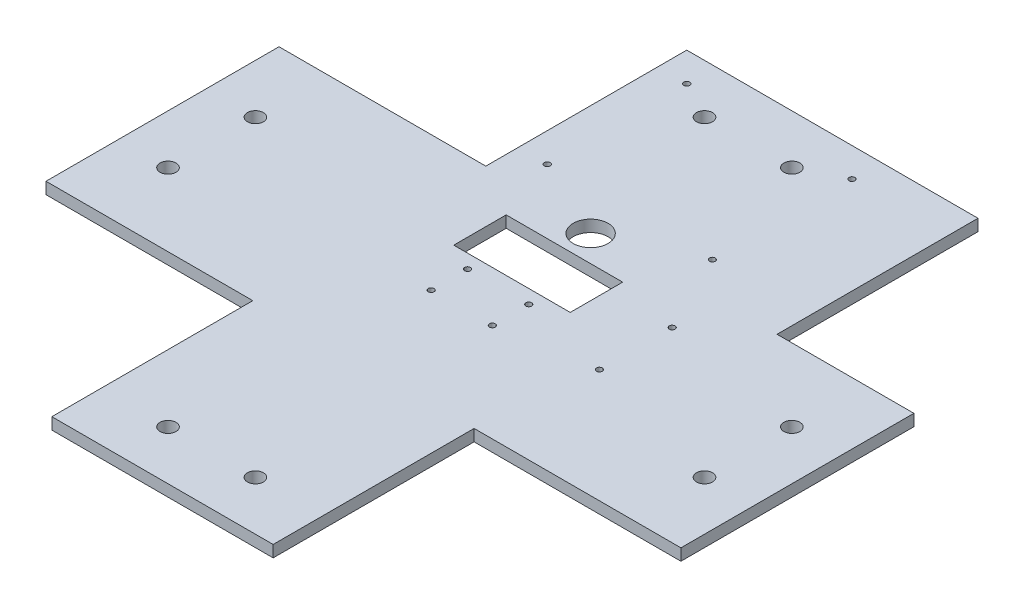
ISO-10303-21;
HEADER;
FILE_DESCRIPTION(('STEP AP214'),'2;1');
FILE_NAME('part.step','',(''),(''),'','','');
FILE_SCHEMA(('AUTOMOTIVE_DESIGN { 1 0 10303 214 1 1 1 1 }'));
ENDSEC;
DATA;
#1=APPLICATION_CONTEXT('core data for automotive mechanical design processes');
#2=APPLICATION_PROTOCOL_DEFINITION('international standard','automotive_design',2000,#1);
#3=PRODUCT_CONTEXT('',#1,'mechanical');
#4=PRODUCT('Part','Part','',(#3));
#5=PRODUCT_RELATED_PRODUCT_CATEGORY('part','',(#4));
#6=PRODUCT_DEFINITION_FORMATION('','',#4);
#7=PRODUCT_DEFINITION_CONTEXT('part definition',#1,'design');
#8=PRODUCT_DEFINITION('design','',#6,#7);
#9=PRODUCT_DEFINITION_SHAPE('','',#8);
#10=(LENGTH_UNIT() NAMED_UNIT(*) SI_UNIT(.MILLI.,.METRE.));
#11=(NAMED_UNIT(*) PLANE_ANGLE_UNIT() SI_UNIT($,.RADIAN.));
#12=(NAMED_UNIT(*) SI_UNIT($,.STERADIAN.) SOLID_ANGLE_UNIT());
#13=UNCERTAINTY_MEASURE_WITH_UNIT(LENGTH_MEASURE(1.E-05),#10,'distance_accuracy_value','');
#14=(GEOMETRIC_REPRESENTATION_CONTEXT(3) GLOBAL_UNCERTAINTY_ASSIGNED_CONTEXT((#13)) GLOBAL_UNIT_ASSIGNED_CONTEXT((#10,
#11,#12)) REPRESENTATION_CONTEXT('',''));
#15=CARTESIAN_POINT('',(0.,0.,0.));
#16=DIRECTION('',(0.,0.,1.));
#17=DIRECTION('',(1.,0.,0.));
#18=AXIS2_PLACEMENT_3D('',#15,#16,#17);
#19=CARTESIAN_POINT('',(50.,4.,-40.));
#20=DIRECTION('',(-1.,0.,0.));
#21=DIRECTION('',(0.,0.,1.));
#22=AXIS2_PLACEMENT_3D('',#19,#20,#21);
#23=PLANE('',#22);
#24=DIRECTION('',(0.,0.,-1.));
#25=VECTOR('',#24,1.);
#26=CARTESIAN_POINT('',(50.,4.,-40.));
#27=LINE('',#26,#25);
#28=CARTESIAN_POINT('',(50.,4.,29.));
#29=VERTEX_POINT('',#28);
#30=CARTESIAN_POINT('',(50.,4.,-40.));
#31=VERTEX_POINT('',#30);
#32=EDGE_CURVE('E57',#29,#31,#27,.T.);
#33=ORIENTED_EDGE('',*,*,#32,.F.);
#34=DIRECTION('',(0.,-1.,0.));
#35=VECTOR('',#34,1.);
#36=CARTESIAN_POINT('',(50.,4.,29.));
#37=LINE('',#36,#35);
#38=CARTESIAN_POINT('',(50.,0.,29.));
#39=VERTEX_POINT('',#38);
#40=EDGE_CURVE('E224',#29,#39,#37,.T.);
#41=ORIENTED_EDGE('',*,*,#40,.T.);
#42=DIRECTION('',(0.,0.,-1.));
#43=VECTOR('',#42,1.);
#44=CARTESIAN_POINT('',(50.,0.,-40.));
#45=LINE('',#44,#43);
#46=CARTESIAN_POINT('',(50.,0.,-40.));
#47=VERTEX_POINT('',#46);
#48=EDGE_CURVE('E328',#39,#47,#45,.T.);
#49=ORIENTED_EDGE('',*,*,#48,.T.);
#50=DIRECTION('',(0.,-1.,0.));
#51=VECTOR('',#50,1.);
#52=CARTESIAN_POINT('',(50.,4.,-40.));
#53=LINE('',#52,#51);
#54=EDGE_CURVE('E11',#31,#47,#53,.T.);
#55=ORIENTED_EDGE('',*,*,#54,.F.);
#56=EDGE_LOOP('',(#33,#41,#49,#55));
#57=FACE_BOUND('',#56,.T.);
#58=ADVANCED_FACE('F35',(#57),#23,.F.);
#59=CARTESIAN_POINT('',(-50.,4.,-40.));
#60=DIRECTION('',(0.,0.,1.));
#61=DIRECTION('',(1.,0.,0.));
#62=AXIS2_PLACEMENT_3D('',#59,#60,#61);
#63=PLANE('',#62);
#64=DIRECTION('',(-1.,0.,0.));
#65=VECTOR('',#64,1.);
#66=CARTESIAN_POINT('',(-50.,0.,-40.));
#67=LINE('',#66,#65);
#68=CARTESIAN_POINT('',(-50.,0.,-40.));
#69=VERTEX_POINT('',#68);
#70=EDGE_CURVE('E341',#47,#69,#67,.T.);
#71=ORIENTED_EDGE('',*,*,#70,.T.);
#72=DIRECTION('',(0.,-1.,0.));
#73=VECTOR('',#72,1.);
#74=CARTESIAN_POINT('',(-50.,4.,-40.));
#75=LINE('',#74,#73);
#76=CARTESIAN_POINT('',(-50.,4.,-40.));
#77=VERTEX_POINT('',#76);
#78=EDGE_CURVE('E42',#77,#69,#75,.T.);
#79=ORIENTED_EDGE('',*,*,#78,.F.);
#80=DIRECTION('',(-1.,0.,0.));
#81=VECTOR('',#80,1.);
#82=CARTESIAN_POINT('',(-50.,4.,-40.));
#83=LINE('',#82,#81);
#84=EDGE_CURVE('E332',#31,#77,#83,.T.);
#85=ORIENTED_EDGE('',*,*,#84,.F.);
#86=ORIENTED_EDGE('',*,*,#54,.T.);
#87=EDGE_LOOP('',(#71,#79,#85,#86));
#88=FACE_BOUND('',#87,.T.);
#89=ADVANCED_FACE('F381',(#88),#63,.F.);
#90=CARTESIAN_POINT('',(-50.,4.,-40.));
#91=DIRECTION('',(1.,0.,0.));
#92=DIRECTION('',(0.,0.,-1.));
#93=AXIS2_PLACEMENT_3D('',#90,#91,#92);
#94=PLANE('',#93);
#95=DIRECTION('',(0.,0.,1.));
#96=VECTOR('',#95,1.);
#97=CARTESIAN_POINT('',(-50.,0.,-40.));
#98=LINE('',#97,#96);
#99=CARTESIAN_POINT('',(-50.,0.,29.));
#100=VERTEX_POINT('',#99);
#101=EDGE_CURVE('E343',#69,#100,#98,.T.);
#102=ORIENTED_EDGE('',*,*,#101,.T.);
#103=DIRECTION('',(0.,-1.,0.));
#104=VECTOR('',#103,1.);
#105=CARTESIAN_POINT('',(-50.,4.,29.));
#106=LINE('',#105,#104);
#107=CARTESIAN_POINT('',(-50.,4.,29.));
#108=VERTEX_POINT('',#107);
#109=EDGE_CURVE('E49',#108,#100,#106,.T.);
#110=ORIENTED_EDGE('',*,*,#109,.F.);
#111=DIRECTION('',(0.,0.,1.));
#112=VECTOR('',#111,1.);
#113=CARTESIAN_POINT('',(-50.,4.,-40.));
#114=LINE('',#113,#112);
#115=EDGE_CURVE('E335',#77,#108,#114,.T.);
#116=ORIENTED_EDGE('',*,*,#115,.F.);
#117=ORIENTED_EDGE('',*,*,#78,.T.);
#118=EDGE_LOOP('',(#102,#110,#116,#117));
#119=FACE_BOUND('',#118,.T.);
#120=ADVANCED_FACE('F348',(#119),#94,.F.);
#121=CARTESIAN_POINT('',(-50.,4.,40.));
#122=DIRECTION('',(0.,0.,-1.));
#123=DIRECTION('',(-1.,0.,0.));
#124=AXIS2_PLACEMENT_3D('',#121,#122,#123);
#125=PLANE('',#124);
#126=DIRECTION('',(1.,0.,0.));
#127=VECTOR('',#126,1.);
#128=CARTESIAN_POINT('',(-50.,4.,40.));
#129=LINE('',#128,#127);
#130=CARTESIAN_POINT('',(-32.0065356366834,4.,40.));
#131=VERTEX_POINT('',#130);
#132=CARTESIAN_POINT('',(7.9934643633166,4.,40.));
#133=VERTEX_POINT('',#132);
#134=EDGE_CURVE('E337',#131,#133,#129,.T.);
#135=ORIENTED_EDGE('',*,*,#134,.F.);
#136=DIRECTION('',(0.,1.,0.));
#137=VECTOR('',#136,1.);
#138=CARTESIAN_POINT('',(-32.0065356366834,0.,40.));
#139=LINE('',#138,#137);
#140=CARTESIAN_POINT('',(-32.0065356366834,0.,40.));
#141=VERTEX_POINT('',#140);
#142=EDGE_CURVE('E298',#141,#131,#139,.T.);
#143=ORIENTED_EDGE('',*,*,#142,.F.);
#144=DIRECTION('',(1.,0.,0.));
#145=VECTOR('',#144,1.);
#146=CARTESIAN_POINT('',(-50.,0.,40.));
#147=LINE('',#146,#145);
#148=CARTESIAN_POINT('',(7.9934643633166,0.,40.));
#149=VERTEX_POINT('',#148);
#150=EDGE_CURVE('E333',#141,#149,#147,.T.);
#151=ORIENTED_EDGE('',*,*,#150,.T.);
#152=DIRECTION('',(0.,1.,0.));
#153=VECTOR('',#152,1.);
#154=CARTESIAN_POINT('',(7.99346436331661,0.,40.));
#155=LINE('',#154,#153);
#156=EDGE_CURVE('E290',#149,#133,#155,.T.);
#157=ORIENTED_EDGE('',*,*,#156,.T.);
#158=EDGE_LOOP('',(#135,#143,#151,#157));
#159=FACE_BOUND('',#158,.T.);
#160=ADVANCED_FACE('F389',(#159),#125,.F.);
#161=CARTESIAN_POINT('',(0.,4.,0.));
#162=DIRECTION('',(0.,1.,0.));
#163=DIRECTION('',(0.,0.,1.));
#164=AXIS2_PLACEMENT_3D('',#161,#162,#163);
#165=PLANE('',#164);
#166=CARTESIAN_POINT('',(-27.0065356366844,4.,161.1));
#167=DIRECTION('',(0.,1.,0.));
#168=DIRECTION('',(0.,0.,-1.));
#169=AXIS2_PLACEMENT_3D('',#166,#167,#168);
#170=CIRCLE('',#169,2.75000000000002);
#171=CARTESIAN_POINT('',(-27.0065356366844,4.,158.35));
#172=VERTEX_POINT('',#171);
#173=EDGE_CURVE('E514',#172,#172,#170,.T.);
#174=ORIENTED_EDGE('',*,*,#173,.F.);
#175=EDGE_LOOP('',(#174));
#176=FACE_BOUND('',#175,.T.);
#177=CARTESIAN_POINT('',(2.99346436331563,4.,161.1));
#178=DIRECTION('',(0.,1.,0.));
#179=DIRECTION('',(0.,0.,1.));
#180=AXIS2_PLACEMENT_3D('',#177,#178,#179);
#181=CIRCLE('',#180,2.75000000000005);
#182=CARTESIAN_POINT('',(2.99346436331563,4.,163.85));
#183=VERTEX_POINT('',#182);
#184=EDGE_CURVE('E516',#183,#183,#181,.T.);
#185=ORIENTED_EDGE('',*,*,#184,.F.);
#186=EDGE_LOOP('',(#185));
#187=FACE_BOUND('',#186,.T.);
#188=CARTESIAN_POINT('',(2.99346436331757,4.,-23.0999999999998));
#189=DIRECTION('',(0.,1.,0.));
#190=DIRECTION('',(0.,0.,-1.));
#191=AXIS2_PLACEMENT_3D('',#188,#189,#190);
#192=CIRCLE('',#191,2.75);
#193=CARTESIAN_POINT('',(2.99346436331757,4.,-25.8499999999998));
#194=VERTEX_POINT('',#193);
#195=EDGE_CURVE('E522',#194,#194,#192,.T.);
#196=ORIENTED_EDGE('',*,*,#195,.F.);
#197=EDGE_LOOP('',(#196));
#198=FACE_BOUND('',#197,.T.);
#199=CARTESIAN_POINT('',(-27.0065356366824,4.,-23.1000000000001));
#200=DIRECTION('',(0.,1.,0.));
#201=DIRECTION('',(0.,0.,1.));
#202=AXIS2_PLACEMENT_3D('',#199,#200,#201);
#203=CIRCLE('',#202,2.74999999999999);
#204=CARTESIAN_POINT('',(-27.0065356366824,4.,-20.3500000000001));
#205=VERTEX_POINT('',#204);
#206=EDGE_CURVE('E528',#205,#205,#203,.T.);
#207=ORIENTED_EDGE('',*,*,#206,.F.);
#208=EDGE_LOOP('',(#207));
#209=FACE_BOUND('',#208,.T.);
#210=CARTESIAN_POINT('',(80.0934643633166,4.,84.));
#211=DIRECTION('',(0.,1.,0.));
#212=DIRECTION('',(0.,0.,-1.));
#213=AXIS2_PLACEMENT_3D('',#210,#211,#212);
#214=CIRCLE('',#213,2.75000000000001);
#215=CARTESIAN_POINT('',(80.0934643633166,4.,81.25));
#216=VERTEX_POINT('',#215);
#217=EDGE_CURVE('E534',#216,#216,#214,.T.);
#218=ORIENTED_EDGE('',*,*,#217,.F.);
#219=EDGE_LOOP('',(#218));
#220=FACE_BOUND('',#219,.T.);
#221=CARTESIAN_POINT('',(80.0934643633166,4.,54.));
#222=DIRECTION('',(0.,1.,0.));
#223=DIRECTION('',(0.,0.,1.));
#224=AXIS2_PLACEMENT_3D('',#221,#222,#223);
#225=CIRCLE('',#224,2.75000000000001);
#226=CARTESIAN_POINT('',(80.0934643633166,4.,56.75));
#227=VERTEX_POINT('',#226);
#228=EDGE_CURVE('E540',#227,#227,#225,.T.);
#229=ORIENTED_EDGE('',*,*,#228,.F.);
#230=EDGE_LOOP('',(#229));
#231=FACE_BOUND('',#230,.T.);
#232=CARTESIAN_POINT('',(-104.106535636683,4.,54.));
#233=DIRECTION('',(0.,1.,0.));
#234=DIRECTION('',(0.,0.,-1.));
#235=AXIS2_PLACEMENT_3D('',#232,#233,#234);
#236=CIRCLE('',#235,2.75000000000001);
#237=CARTESIAN_POINT('',(-104.106535636683,4.,51.25));
#238=VERTEX_POINT('',#237);
#239=EDGE_CURVE('E546',#238,#238,#236,.T.);
#240=ORIENTED_EDGE('',*,*,#239,.F.);
#241=EDGE_LOOP('',(#240));
#242=FACE_BOUND('',#241,.T.);
#243=CARTESIAN_POINT('',(-104.106535636683,4.,84.));
#244=DIRECTION('',(0.,1.,0.));
#245=DIRECTION('',(0.,0.,1.));
#246=AXIS2_PLACEMENT_3D('',#243,#244,#245);
#247=CIRCLE('',#246,2.75000000000001);
#248=CARTESIAN_POINT('',(-104.106535636683,4.,86.75));
#249=VERTEX_POINT('',#248);
#250=EDGE_CURVE('E181',#249,#249,#247,.T.);
#251=ORIENTED_EDGE('',*,*,#250,.F.);
#252=EDGE_LOOP('',(#251));
#253=FACE_BOUND('',#252,.T.);
#254=DIRECTION('',(1.,0.,0.));
#255=VECTOR('',#254,1.);
#256=CARTESIAN_POINT('',(96.9934643633166,4.,29.));
#257=LINE('',#256,#255);
#258=CARTESIAN_POINT('',(96.9934643633166,4.,29.));
#259=VERTEX_POINT('',#258);
#260=EDGE_CURVE('E159',#29,#259,#257,.T.);
#261=ORIENTED_EDGE('',*,*,#260,.F.);
#262=ORIENTED_EDGE('',*,*,#32,.T.);
#263=ORIENTED_EDGE('',*,*,#84,.T.);
#264=ORIENTED_EDGE('',*,*,#115,.T.);
#265=DIRECTION('',(1.,0.,0.));
#266=VECTOR('',#265,1.);
#267=CARTESIAN_POINT('',(-50.,4.,29.));
#268=LINE('',#267,#266);
#269=CARTESIAN_POINT('',(-121.006535636683,4.,29.));
#270=VERTEX_POINT('',#269);
#271=EDGE_CURVE('E197',#270,#108,#268,.T.);
#272=ORIENTED_EDGE('',*,*,#271,.F.);
#273=DIRECTION('',(0.,0.,-1.));
#274=VECTOR('',#273,1.);
#275=CARTESIAN_POINT('',(-121.006535636683,4.,29.));
#276=LINE('',#275,#274);
#277=CARTESIAN_POINT('',(-121.006535636683,4.,109.));
#278=VERTEX_POINT('',#277);
#279=EDGE_CURVE('E194',#278,#270,#276,.T.);
#280=ORIENTED_EDGE('',*,*,#279,.F.);
#281=DIRECTION('',(-1.,0.,0.));
#282=VECTOR('',#281,1.);
#283=CARTESIAN_POINT('',(-50.,4.,109.));
#284=LINE('',#283,#282);
#285=CARTESIAN_POINT('',(-50.,4.,109.));
#286=VERTEX_POINT('',#285);
#287=EDGE_CURVE('E191',#286,#278,#284,.T.);
#288=ORIENTED_EDGE('',*,*,#287,.F.);
#289=DIRECTION('',(0.,0.,-1.));
#290=VECTOR('',#289,1.);
#291=CARTESIAN_POINT('',(-50.,4.,178.));
#292=LINE('',#291,#290);
#293=CARTESIAN_POINT('',(-50.,4.,178.));
#294=VERTEX_POINT('',#293);
#295=EDGE_CURVE('E188',#294,#286,#292,.T.);
#296=ORIENTED_EDGE('',*,*,#295,.F.);
#297=DIRECTION('',(-1.,0.,0.));
#298=VECTOR('',#297,1.);
#299=CARTESIAN_POINT('',(-50.,4.,178.));
#300=LINE('',#299,#298);
#301=CARTESIAN_POINT('',(25.9869287266332,4.,178.));
#302=VERTEX_POINT('',#301);
#303=EDGE_CURVE('E185',#302,#294,#300,.T.);
#304=ORIENTED_EDGE('',*,*,#303,.F.);
#305=DIRECTION('',(0.,0.,1.));
#306=VECTOR('',#305,1.);
#307=CARTESIAN_POINT('',(25.9869287266332,4.,178.));
#308=LINE('',#307,#306);
#309=CARTESIAN_POINT('',(25.9869287266332,4.,109.));
#310=VERTEX_POINT('',#309);
#311=EDGE_CURVE('E171',#310,#302,#308,.T.);
#312=ORIENTED_EDGE('',*,*,#311,.F.);
#313=DIRECTION('',(-1.,0.,0.));
#314=VECTOR('',#313,1.);
#315=CARTESIAN_POINT('',(96.9934643633166,4.,109.));
#316=LINE('',#315,#314);
#317=CARTESIAN_POINT('',(96.9934643633166,4.,109.));
#318=VERTEX_POINT('',#317);
#319=EDGE_CURVE('E151',#318,#310,#316,.T.);
#320=ORIENTED_EDGE('',*,*,#319,.F.);
#321=DIRECTION('',(0.,0.,1.));
#322=VECTOR('',#321,1.);
#323=CARTESIAN_POINT('',(96.9934643633166,4.,29.));
#324=LINE('',#323,#322);
#325=EDGE_CURVE('E167',#259,#318,#324,.T.);
#326=ORIENTED_EDGE('',*,*,#325,.F.);
#327=EDGE_LOOP('',(#261,#262,#263,#264,#272,#280,#288,#296,#304,#312,#320,#326));
#328=FACE_BOUND('',#327,.T.);
#329=CARTESIAN_POINT('',(-12.0065356366834,4.,31.));
#330=DIRECTION('',(0.,1.,0.));
#331=DIRECTION('',(0.,0.,1.));
#332=AXIS2_PLACEMENT_3D('',#329,#330,#331);
#333=CIRCLE('',#332,6.);
#334=CARTESIAN_POINT('',(-12.0065356366834,4.,37.));
#335=VERTEX_POINT('',#334);
#336=EDGE_CURVE('E223',#335,#335,#333,.T.);
#337=ORIENTED_EDGE('',*,*,#336,.F.);
#338=EDGE_LOOP('',(#337));
#339=FACE_BOUND('',#338,.T.);
#340=CARTESIAN_POINT('',(30.,4.,70.));
#341=DIRECTION('',(0.,1.,0.));
#342=DIRECTION('',(0.,0.,1.));
#343=AXIS2_PLACEMENT_3D('',#340,#341,#342);
#344=CIRCLE('',#343,0.999999999999998);
#345=CARTESIAN_POINT('',(30.,4.,71.));
#346=VERTEX_POINT('',#345);
#347=EDGE_CURVE('E241',#346,#346,#344,.T.);
#348=ORIENTED_EDGE('',*,*,#347,.F.);
#349=EDGE_LOOP('',(#348));
#350=FACE_BOUND('',#349,.T.);
#351=CARTESIAN_POINT('',(30.,4.,45.));
#352=DIRECTION('',(0.,1.,0.));
#353=DIRECTION('',(0.,0.,1.));
#354=AXIS2_PLACEMENT_3D('',#351,#352,#353);
#355=CIRCLE('',#354,0.999999999999998);
#356=CARTESIAN_POINT('',(30.,4.,46.));
#357=VERTEX_POINT('',#356);
#358=EDGE_CURVE('E247',#357,#357,#355,.T.);
#359=ORIENTED_EDGE('',*,*,#358,.F.);
#360=EDGE_LOOP('',(#359));
#361=FACE_BOUND('',#360,.T.);
#362=CARTESIAN_POINT('',(-1.50653563668339,4.,62.75));
#363=DIRECTION('',(0.,1.,0.));
#364=DIRECTION('',(0.,0.,1.));
#365=AXIS2_PLACEMENT_3D('',#362,#363,#364);
#366=CIRCLE('',#365,1.);
#367=CARTESIAN_POINT('',(-1.50653563668339,4.,63.75));
#368=VERTEX_POINT('',#367);
#369=EDGE_CURVE('E253',#368,#368,#366,.T.);
#370=ORIENTED_EDGE('',*,*,#369,.F.);
#371=EDGE_LOOP('',(#370));
#372=FACE_BOUND('',#371,.T.);
#373=CARTESIAN_POINT('',(-1.50653563668339,4.,75.25));
#374=DIRECTION('',(0.,1.,0.));
#375=DIRECTION('',(0.,0.,1.));
#376=AXIS2_PLACEMENT_3D('',#373,#374,#375);
#377=CIRCLE('',#376,1.);
#378=CARTESIAN_POINT('',(-1.50653563668339,4.,76.25));
#379=VERTEX_POINT('',#378);
#380=EDGE_CURVE('E259',#379,#379,#377,.T.);
#381=ORIENTED_EDGE('',*,*,#380,.F.);
#382=EDGE_LOOP('',(#381));
#383=FACE_BOUND('',#382,.T.);
#384=CARTESIAN_POINT('',(-22.5065356366834,4.,75.25));
#385=DIRECTION('',(0.,1.,0.));
#386=DIRECTION('',(0.,0.,1.));
#387=AXIS2_PLACEMENT_3D('',#384,#385,#386);
#388=CIRCLE('',#387,1.);
#389=CARTESIAN_POINT('',(-22.5065356366834,4.,76.25));
#390=VERTEX_POINT('',#389);
#391=EDGE_CURVE('E265',#390,#390,#388,.T.);
#392=ORIENTED_EDGE('',*,*,#391,.F.);
#393=EDGE_LOOP('',(#392));
#394=FACE_BOUND('',#393,.T.);
#395=CARTESIAN_POINT('',(-22.5065356366834,4.,62.75));
#396=DIRECTION('',(0.,1.,0.));
#397=DIRECTION('',(0.,0.,1.));
#398=AXIS2_PLACEMENT_3D('',#395,#396,#397);
#399=CIRCLE('',#398,1.);
#400=CARTESIAN_POINT('',(-22.5065356366834,4.,63.75));
#401=VERTEX_POINT('',#400);
#402=EDGE_CURVE('E271',#401,#401,#399,.T.);
#403=ORIENTED_EDGE('',*,*,#402,.F.);
#404=EDGE_LOOP('',(#403));
#405=FACE_BOUND('',#404,.T.);
#406=DIRECTION('',(0.,0.,-1.));
#407=VECTOR('',#406,1.);
#408=CARTESIAN_POINT('',(-32.0065356366834,4.,40.));
#409=LINE('',#408,#407);
#410=CARTESIAN_POINT('',(-32.0065356366834,4.,58.));
#411=VERTEX_POINT('',#410);
#412=EDGE_CURVE('E284',#411,#131,#409,.T.);
#413=ORIENTED_EDGE('',*,*,#412,.T.);
#414=ORIENTED_EDGE('',*,*,#134,.T.);
#415=DIRECTION('',(0.,0.,1.));
#416=VECTOR('',#415,1.);
#417=CARTESIAN_POINT('',(7.99346436331661,4.,40.));
#418=LINE('',#417,#416);
#419=CARTESIAN_POINT('',(7.9934643633166,4.,58.));
#420=VERTEX_POINT('',#419);
#421=EDGE_CURVE('E277',#133,#420,#418,.T.);
#422=ORIENTED_EDGE('',*,*,#421,.T.);
#423=DIRECTION('',(-1.,0.,0.));
#424=VECTOR('',#423,1.);
#425=CARTESIAN_POINT('',(-32.0065356366834,4.,58.));
#426=LINE('',#425,#424);
#427=EDGE_CURVE('E293',#420,#411,#426,.T.);
#428=ORIENTED_EDGE('',*,*,#427,.T.);
#429=EDGE_LOOP('',(#413,#414,#422,#428));
#430=FACE_BOUND('',#429,.T.);
#431=CARTESIAN_POINT('',(-40.,4.,17.9));
#432=DIRECTION('',(0.,1.,0.));
#433=DIRECTION('',(0.,0.,1.));
#434=AXIS2_PLACEMENT_3D('',#431,#432,#433);
#435=CIRCLE('',#434,0.999999999999998);
#436=CARTESIAN_POINT('',(-40.,4.,18.9));
#437=VERTEX_POINT('',#436);
#438=EDGE_CURVE('E301',#437,#437,#435,.T.);
#439=ORIENTED_EDGE('',*,*,#438,.F.);
#440=EDGE_LOOP('',(#439));
#441=FACE_BOUND('',#440,.T.);
#442=CARTESIAN_POINT('',(16.7,4.,17.9));
#443=DIRECTION('',(0.,1.,0.));
#444=DIRECTION('',(0.,0.,1.));
#445=AXIS2_PLACEMENT_3D('',#442,#443,#444);
#446=CIRCLE('',#445,1.);
#447=CARTESIAN_POINT('',(16.7,4.,18.9));
#448=VERTEX_POINT('',#447);
#449=EDGE_CURVE('E310',#448,#448,#446,.T.);
#450=ORIENTED_EDGE('',*,*,#449,.F.);
#451=EDGE_LOOP('',(#450));
#452=FACE_BOUND('',#451,.T.);
#453=CARTESIAN_POINT('',(16.7,4.,-30.));
#454=DIRECTION('',(0.,1.,0.));
#455=DIRECTION('',(0.,0.,1.));
#456=AXIS2_PLACEMENT_3D('',#453,#454,#455);
#457=CIRCLE('',#456,1.);
#458=CARTESIAN_POINT('',(16.7,4.,-29.));
#459=VERTEX_POINT('',#458);
#460=EDGE_CURVE('E316',#459,#459,#457,.T.);
#461=ORIENTED_EDGE('',*,*,#460,.F.);
#462=EDGE_LOOP('',(#461));
#463=FACE_BOUND('',#462,.T.);
#464=CARTESIAN_POINT('',(-40.,4.,-30.));
#465=DIRECTION('',(0.,1.,0.));
#466=DIRECTION('',(0.,0.,1.));
#467=AXIS2_PLACEMENT_3D('',#464,#465,#466);
#468=CIRCLE('',#467,0.999999999999998);
#469=CARTESIAN_POINT('',(-40.,4.,-29.));
#470=VERTEX_POINT('',#469);
#471=EDGE_CURVE('E322',#470,#470,#468,.T.);
#472=ORIENTED_EDGE('',*,*,#471,.F.);
#473=EDGE_LOOP('',(#472));
#474=FACE_BOUND('',#473,.T.);
#475=ADVANCED_FACE('F165',(#176,#187,#198,#209,#220,#231,#242,#253,#328,#339,#350,#361,#372,
#383,#394,#405,#430,#441,#452,#463,#474),#165,.T.);
#476=CARTESIAN_POINT('',(0.,0.,0.));
#477=DIRECTION('',(0.,1.,0.));
#478=DIRECTION('',(0.,0.,1.));
#479=AXIS2_PLACEMENT_3D('',#476,#477,#478);
#480=PLANE('',#479);
#481=CARTESIAN_POINT('',(-27.0065356366844,0.,161.1));
#482=DIRECTION('',(0.,1.,0.));
#483=DIRECTION('',(0.,0.,-1.));
#484=AXIS2_PLACEMENT_3D('',#481,#482,#483);
#485=CIRCLE('',#484,2.75000000000002);
#486=CARTESIAN_POINT('',(-27.0065356366844,0.,158.35));
#487=VERTEX_POINT('',#486);
#488=EDGE_CURVE('E511',#487,#487,#485,.T.);
#489=ORIENTED_EDGE('',*,*,#488,.T.);
#490=EDGE_LOOP('',(#489));
#491=FACE_BOUND('',#490,.T.);
#492=CARTESIAN_POINT('',(2.99346436331563,0.,161.1));
#493=DIRECTION('',(0.,1.,0.));
#494=DIRECTION('',(0.,0.,1.));
#495=AXIS2_PLACEMENT_3D('',#492,#493,#494);
#496=CIRCLE('',#495,2.75000000000005);
#497=CARTESIAN_POINT('',(2.99346436331563,0.,163.85));
#498=VERTEX_POINT('',#497);
#499=EDGE_CURVE('E519',#498,#498,#496,.T.);
#500=ORIENTED_EDGE('',*,*,#499,.T.);
#501=EDGE_LOOP('',(#500));
#502=FACE_BOUND('',#501,.T.);
#503=CARTESIAN_POINT('',(2.99346436331757,0.,-23.0999999999998));
#504=DIRECTION('',(0.,1.,0.));
#505=DIRECTION('',(0.,0.,-1.));
#506=AXIS2_PLACEMENT_3D('',#503,#504,#505);
#507=CIRCLE('',#506,2.75);
#508=CARTESIAN_POINT('',(2.99346436331757,0.,-25.8499999999998));
#509=VERTEX_POINT('',#508);
#510=EDGE_CURVE('E525',#509,#509,#507,.T.);
#511=ORIENTED_EDGE('',*,*,#510,.T.);
#512=EDGE_LOOP('',(#511));
#513=FACE_BOUND('',#512,.T.);
#514=CARTESIAN_POINT('',(-27.0065356366824,0.,-23.1000000000001));
#515=DIRECTION('',(0.,1.,0.));
#516=DIRECTION('',(0.,0.,1.));
#517=AXIS2_PLACEMENT_3D('',#514,#515,#516);
#518=CIRCLE('',#517,2.74999999999999);
#519=CARTESIAN_POINT('',(-27.0065356366824,0.,-20.3500000000001));
#520=VERTEX_POINT('',#519);
#521=EDGE_CURVE('E531',#520,#520,#518,.T.);
#522=ORIENTED_EDGE('',*,*,#521,.T.);
#523=EDGE_LOOP('',(#522));
#524=FACE_BOUND('',#523,.T.);
#525=CARTESIAN_POINT('',(80.0934643633166,0.,84.));
#526=DIRECTION('',(0.,1.,0.));
#527=DIRECTION('',(0.,0.,-1.));
#528=AXIS2_PLACEMENT_3D('',#525,#526,#527);
#529=CIRCLE('',#528,2.75000000000001);
#530=CARTESIAN_POINT('',(80.0934643633166,0.,81.25));
#531=VERTEX_POINT('',#530);
#532=EDGE_CURVE('E537',#531,#531,#529,.T.);
#533=ORIENTED_EDGE('',*,*,#532,.T.);
#534=EDGE_LOOP('',(#533));
#535=FACE_BOUND('',#534,.T.);
#536=CARTESIAN_POINT('',(80.0934643633166,0.,54.));
#537=DIRECTION('',(0.,1.,0.));
#538=DIRECTION('',(0.,0.,1.));
#539=AXIS2_PLACEMENT_3D('',#536,#537,#538);
#540=CIRCLE('',#539,2.75000000000001);
#541=CARTESIAN_POINT('',(80.0934643633166,0.,56.75));
#542=VERTEX_POINT('',#541);
#543=EDGE_CURVE('E543',#542,#542,#540,.T.);
#544=ORIENTED_EDGE('',*,*,#543,.T.);
#545=EDGE_LOOP('',(#544));
#546=FACE_BOUND('',#545,.T.);
#547=CARTESIAN_POINT('',(-104.106535636683,0.,54.));
#548=DIRECTION('',(0.,1.,0.));
#549=DIRECTION('',(0.,0.,-1.));
#550=AXIS2_PLACEMENT_3D('',#547,#548,#549);
#551=CIRCLE('',#550,2.75000000000001);
#552=CARTESIAN_POINT('',(-104.106535636683,0.,51.25));
#553=VERTEX_POINT('',#552);
#554=EDGE_CURVE('E549',#553,#553,#551,.T.);
#555=ORIENTED_EDGE('',*,*,#554,.T.);
#556=EDGE_LOOP('',(#555));
#557=FACE_BOUND('',#556,.T.);
#558=CARTESIAN_POINT('',(-104.106535636683,0.,84.));
#559=DIRECTION('',(0.,1.,0.));
#560=DIRECTION('',(0.,0.,1.));
#561=AXIS2_PLACEMENT_3D('',#558,#559,#560);
#562=CIRCLE('',#561,2.75000000000001);
#563=CARTESIAN_POINT('',(-104.106535636683,0.,86.75));
#564=VERTEX_POINT('',#563);
#565=EDGE_CURVE('E203',#564,#564,#562,.T.);
#566=ORIENTED_EDGE('',*,*,#565,.T.);
#567=EDGE_LOOP('',(#566));
#568=FACE_BOUND('',#567,.T.);
#569=ORIENTED_EDGE('',*,*,#48,.F.);
#570=DIRECTION('',(1.,0.,0.));
#571=VECTOR('',#570,1.);
#572=CARTESIAN_POINT('',(96.9934643633166,0.,29.));
#573=LINE('',#572,#571);
#574=CARTESIAN_POINT('',(96.9934643633166,0.,29.));
#575=VERTEX_POINT('',#574);
#576=EDGE_CURVE('E175',#39,#575,#573,.T.);
#577=ORIENTED_EDGE('',*,*,#576,.T.);
#578=DIRECTION('',(0.,0.,1.));
#579=VECTOR('',#578,1.);
#580=CARTESIAN_POINT('',(96.9934643633166,0.,29.));
#581=LINE('',#580,#579);
#582=CARTESIAN_POINT('',(96.9934643633166,0.,109.));
#583=VERTEX_POINT('',#582);
#584=EDGE_CURVE('E201',#575,#583,#581,.T.);
#585=ORIENTED_EDGE('',*,*,#584,.T.);
#586=DIRECTION('',(-1.,0.,0.));
#587=VECTOR('',#586,1.);
#588=CARTESIAN_POINT('',(96.9934643633166,0.,109.));
#589=LINE('',#588,#587);
#590=CARTESIAN_POINT('',(25.9869287266332,0.,109.));
#591=VERTEX_POINT('',#590);
#592=EDGE_CURVE('E153',#583,#591,#589,.T.);
#593=ORIENTED_EDGE('',*,*,#592,.T.);
#594=DIRECTION('',(0.,0.,1.));
#595=VECTOR('',#594,1.);
#596=CARTESIAN_POINT('',(25.9869287266332,0.,178.));
#597=LINE('',#596,#595);
#598=CARTESIAN_POINT('',(25.9869287266332,0.,178.));
#599=VERTEX_POINT('',#598);
#600=EDGE_CURVE('E205',#591,#599,#597,.T.);
#601=ORIENTED_EDGE('',*,*,#600,.T.);
#602=DIRECTION('',(-1.,0.,0.));
#603=VECTOR('',#602,1.);
#604=CARTESIAN_POINT('',(-50.,0.,178.));
#605=LINE('',#604,#603);
#606=CARTESIAN_POINT('',(-50.,0.,178.));
#607=VERTEX_POINT('',#606);
#608=EDGE_CURVE('E208',#599,#607,#605,.T.);
#609=ORIENTED_EDGE('',*,*,#608,.T.);
#610=DIRECTION('',(0.,0.,-1.));
#611=VECTOR('',#610,1.);
#612=CARTESIAN_POINT('',(-50.,0.,178.));
#613=LINE('',#612,#611);
#614=CARTESIAN_POINT('',(-50.,0.,109.));
#615=VERTEX_POINT('',#614);
#616=EDGE_CURVE('E211',#607,#615,#613,.T.);
#617=ORIENTED_EDGE('',*,*,#616,.T.);
#618=DIRECTION('',(-1.,0.,0.));
#619=VECTOR('',#618,1.);
#620=CARTESIAN_POINT('',(-50.,0.,109.));
#621=LINE('',#620,#619);
#622=CARTESIAN_POINT('',(-121.006535636683,0.,109.));
#623=VERTEX_POINT('',#622);
#624=EDGE_CURVE('E214',#615,#623,#621,.T.);
#625=ORIENTED_EDGE('',*,*,#624,.T.);
#626=DIRECTION('',(0.,0.,-1.));
#627=VECTOR('',#626,1.);
#628=CARTESIAN_POINT('',(-121.006535636683,0.,29.));
#629=LINE('',#628,#627);
#630=CARTESIAN_POINT('',(-121.006535636683,0.,29.));
#631=VERTEX_POINT('',#630);
#632=EDGE_CURVE('E217',#623,#631,#629,.T.);
#633=ORIENTED_EDGE('',*,*,#632,.T.);
#634=DIRECTION('',(1.,0.,0.));
#635=VECTOR('',#634,1.);
#636=CARTESIAN_POINT('',(-50.,0.,29.));
#637=LINE('',#636,#635);
#638=EDGE_CURVE('E178',#631,#100,#637,.T.);
#639=ORIENTED_EDGE('',*,*,#638,.T.);
#640=ORIENTED_EDGE('',*,*,#101,.F.);
#641=ORIENTED_EDGE('',*,*,#70,.F.);
#642=EDGE_LOOP('',(#569,#577,#585,#593,#601,#609,#617,#625,#633,#639,#640,#641));
#643=FACE_BOUND('',#642,.T.);
#644=CARTESIAN_POINT('',(-12.0065356366834,0.,31.));
#645=DIRECTION('',(0.,1.,0.));
#646=DIRECTION('',(0.,0.,1.));
#647=AXIS2_PLACEMENT_3D('',#644,#645,#646);
#648=CIRCLE('',#647,6.);
#649=CARTESIAN_POINT('',(-12.0065356366834,0.,37.));
#650=VERTEX_POINT('',#649);
#651=EDGE_CURVE('E238',#650,#650,#648,.T.);
#652=ORIENTED_EDGE('',*,*,#651,.T.);
#653=EDGE_LOOP('',(#652));
#654=FACE_BOUND('',#653,.T.);
#655=CARTESIAN_POINT('',(30.,0.,70.));
#656=DIRECTION('',(0.,1.,0.));
#657=DIRECTION('',(0.,0.,1.));
#658=AXIS2_PLACEMENT_3D('',#655,#656,#657);
#659=CIRCLE('',#658,0.999999999999998);
#660=CARTESIAN_POINT('',(30.,0.,71.));
#661=VERTEX_POINT('',#660);
#662=EDGE_CURVE('E244',#661,#661,#659,.T.);
#663=ORIENTED_EDGE('',*,*,#662,.T.);
#664=EDGE_LOOP('',(#663));
#665=FACE_BOUND('',#664,.T.);
#666=CARTESIAN_POINT('',(30.,0.,45.));
#667=DIRECTION('',(0.,1.,0.));
#668=DIRECTION('',(0.,0.,1.));
#669=AXIS2_PLACEMENT_3D('',#666,#667,#668);
#670=CIRCLE('',#669,0.999999999999998);
#671=CARTESIAN_POINT('',(30.,0.,46.));
#672=VERTEX_POINT('',#671);
#673=EDGE_CURVE('E250',#672,#672,#670,.T.);
#674=ORIENTED_EDGE('',*,*,#673,.T.);
#675=EDGE_LOOP('',(#674));
#676=FACE_BOUND('',#675,.T.);
#677=CARTESIAN_POINT('',(-1.50653563668339,0.,62.75));
#678=DIRECTION('',(0.,1.,0.));
#679=DIRECTION('',(0.,0.,1.));
#680=AXIS2_PLACEMENT_3D('',#677,#678,#679);
#681=CIRCLE('',#680,1.);
#682=CARTESIAN_POINT('',(-1.50653563668339,0.,63.75));
#683=VERTEX_POINT('',#682);
#684=EDGE_CURVE('E256',#683,#683,#681,.T.);
#685=ORIENTED_EDGE('',*,*,#684,.T.);
#686=EDGE_LOOP('',(#685));
#687=FACE_BOUND('',#686,.T.);
#688=CARTESIAN_POINT('',(-1.50653563668339,0.,75.25));
#689=DIRECTION('',(0.,1.,0.));
#690=DIRECTION('',(0.,0.,1.));
#691=AXIS2_PLACEMENT_3D('',#688,#689,#690);
#692=CIRCLE('',#691,1.);
#693=CARTESIAN_POINT('',(-1.50653563668339,0.,76.25));
#694=VERTEX_POINT('',#693);
#695=EDGE_CURVE('E262',#694,#694,#692,.T.);
#696=ORIENTED_EDGE('',*,*,#695,.T.);
#697=EDGE_LOOP('',(#696));
#698=FACE_BOUND('',#697,.T.);
#699=CARTESIAN_POINT('',(-22.5065356366834,0.,75.25));
#700=DIRECTION('',(0.,1.,0.));
#701=DIRECTION('',(0.,0.,1.));
#702=AXIS2_PLACEMENT_3D('',#699,#700,#701);
#703=CIRCLE('',#702,1.);
#704=CARTESIAN_POINT('',(-22.5065356366834,0.,76.25));
#705=VERTEX_POINT('',#704);
#706=EDGE_CURVE('E268',#705,#705,#703,.T.);
#707=ORIENTED_EDGE('',*,*,#706,.T.);
#708=EDGE_LOOP('',(#707));
#709=FACE_BOUND('',#708,.T.);
#710=CARTESIAN_POINT('',(-22.5065356366834,0.,62.75));
#711=DIRECTION('',(0.,1.,0.));
#712=DIRECTION('',(0.,0.,1.));
#713=AXIS2_PLACEMENT_3D('',#710,#711,#712);
#714=CIRCLE('',#713,1.);
#715=CARTESIAN_POINT('',(-22.5065356366834,0.,63.75));
#716=VERTEX_POINT('',#715);
#717=EDGE_CURVE('E274',#716,#716,#714,.T.);
#718=ORIENTED_EDGE('',*,*,#717,.T.);
#719=EDGE_LOOP('',(#718));
#720=FACE_BOUND('',#719,.T.);
#721=ORIENTED_EDGE('',*,*,#150,.F.);
#722=DIRECTION('',(0.,0.,-1.));
#723=VECTOR('',#722,1.);
#724=CARTESIAN_POINT('',(-32.0065356366834,0.,40.));
#725=LINE('',#724,#723);
#726=CARTESIAN_POINT('',(-32.0065356366834,0.,58.));
#727=VERTEX_POINT('',#726);
#728=EDGE_CURVE('E287',#727,#141,#725,.T.);
#729=ORIENTED_EDGE('',*,*,#728,.F.);
#730=DIRECTION('',(-1.,0.,0.));
#731=VECTOR('',#730,1.);
#732=CARTESIAN_POINT('',(-32.0065356366834,0.,58.));
#733=LINE('',#732,#731);
#734=CARTESIAN_POINT('',(7.9934643633166,0.,58.));
#735=VERTEX_POINT('',#734);
#736=EDGE_CURVE('E283',#735,#727,#733,.T.);
#737=ORIENTED_EDGE('',*,*,#736,.F.);
#738=DIRECTION('',(0.,0.,1.));
#739=VECTOR('',#738,1.);
#740=CARTESIAN_POINT('',(7.99346436331661,0.,40.));
#741=LINE('',#740,#739);
#742=EDGE_CURVE('E280',#149,#735,#741,.T.);
#743=ORIENTED_EDGE('',*,*,#742,.F.);
#744=EDGE_LOOP('',(#721,#729,#737,#743));
#745=FACE_BOUND('',#744,.T.);
#746=CARTESIAN_POINT('',(-40.,0.,17.9));
#747=DIRECTION('',(0.,1.,0.));
#748=DIRECTION('',(0.,0.,1.));
#749=AXIS2_PLACEMENT_3D('',#746,#747,#748);
#750=CIRCLE('',#749,0.999999999999998);
#751=CARTESIAN_POINT('',(-40.,0.,18.9));
#752=VERTEX_POINT('',#751);
#753=EDGE_CURVE('E307',#752,#752,#750,.T.);
#754=ORIENTED_EDGE('',*,*,#753,.T.);
#755=EDGE_LOOP('',(#754));
#756=FACE_BOUND('',#755,.T.);
#757=CARTESIAN_POINT('',(16.7,0.,17.9));
#758=DIRECTION('',(0.,1.,0.));
#759=DIRECTION('',(0.,0.,1.));
#760=AXIS2_PLACEMENT_3D('',#757,#758,#759);
#761=CIRCLE('',#760,1.);
#762=CARTESIAN_POINT('',(16.7,0.,18.9));
#763=VERTEX_POINT('',#762);
#764=EDGE_CURVE('E313',#763,#763,#761,.T.);
#765=ORIENTED_EDGE('',*,*,#764,.T.);
#766=EDGE_LOOP('',(#765));
#767=FACE_BOUND('',#766,.T.);
#768=CARTESIAN_POINT('',(16.7,0.,-30.));
#769=DIRECTION('',(0.,1.,0.));
#770=DIRECTION('',(0.,0.,1.));
#771=AXIS2_PLACEMENT_3D('',#768,#769,#770);
#772=CIRCLE('',#771,1.);
#773=CARTESIAN_POINT('',(16.7,0.,-29.));
#774=VERTEX_POINT('',#773);
#775=EDGE_CURVE('E319',#774,#774,#772,.T.);
#776=ORIENTED_EDGE('',*,*,#775,.T.);
#777=EDGE_LOOP('',(#776));
#778=FACE_BOUND('',#777,.T.);
#779=CARTESIAN_POINT('',(-40.,0.,-30.));
#780=DIRECTION('',(0.,1.,0.));
#781=DIRECTION('',(0.,0.,1.));
#782=AXIS2_PLACEMENT_3D('',#779,#780,#781);
#783=CIRCLE('',#782,0.999999999999998);
#784=CARTESIAN_POINT('',(-40.,0.,-29.));
#785=VERTEX_POINT('',#784);
#786=EDGE_CURVE('E325',#785,#785,#783,.T.);
#787=ORIENTED_EDGE('',*,*,#786,.T.);
#788=EDGE_LOOP('',(#787));
#789=FACE_BOUND('',#788,.T.);
#790=ADVANCED_FACE('F354',(#491,#502,#513,#524,#535,#546,#557,#568,#643,#654,#665,#676,#687,
#698,#709,#720,#745,#756,#767,#778,#789),#480,.F.);
#791=CARTESIAN_POINT('',(-40.,0.,-30.));
#792=DIRECTION('',(0.,1.,0.));
#793=DIRECTION('',(0.,0.,1.));
#794=AXIS2_PLACEMENT_3D('',#791,#792,#793);
#795=CYLINDRICAL_SURFACE('',#794,0.999999999999998);
#796=ORIENTED_EDGE('',*,*,#786,.F.);
#797=EDGE_LOOP('',(#796));
#798=FACE_BOUND('',#797,.T.);
#799=ORIENTED_EDGE('',*,*,#471,.T.);
#800=EDGE_LOOP('',(#799));
#801=FACE_BOUND('',#800,.T.);
#802=ADVANCED_FACE('F397',(#798,#801),#795,.F.);
#803=CARTESIAN_POINT('',(16.7,0.,-30.));
#804=DIRECTION('',(0.,1.,0.));
#805=DIRECTION('',(0.,0.,1.));
#806=AXIS2_PLACEMENT_3D('',#803,#804,#805);
#807=CYLINDRICAL_SURFACE('',#806,1.);
#808=ORIENTED_EDGE('',*,*,#775,.F.);
#809=EDGE_LOOP('',(#808));
#810=FACE_BOUND('',#809,.T.);
#811=ORIENTED_EDGE('',*,*,#460,.T.);
#812=EDGE_LOOP('',(#811));
#813=FACE_BOUND('',#812,.T.);
#814=ADVANCED_FACE('F404',(#810,#813),#807,.F.);
#815=CARTESIAN_POINT('',(16.7,0.,17.9));
#816=DIRECTION('',(0.,1.,0.));
#817=DIRECTION('',(0.,0.,1.));
#818=AXIS2_PLACEMENT_3D('',#815,#816,#817);
#819=CYLINDRICAL_SURFACE('',#818,1.);
#820=ORIENTED_EDGE('',*,*,#764,.F.);
#821=EDGE_LOOP('',(#820));
#822=FACE_BOUND('',#821,.T.);
#823=ORIENTED_EDGE('',*,*,#449,.T.);
#824=EDGE_LOOP('',(#823));
#825=FACE_BOUND('',#824,.T.);
#826=ADVANCED_FACE('F408',(#822,#825),#819,.F.);
#827=CARTESIAN_POINT('',(-40.,0.,17.9));
#828=DIRECTION('',(0.,1.,0.));
#829=DIRECTION('',(0.,0.,1.));
#830=AXIS2_PLACEMENT_3D('',#827,#828,#829);
#831=CYLINDRICAL_SURFACE('',#830,0.999999999999998);
#832=ORIENTED_EDGE('',*,*,#753,.F.);
#833=EDGE_LOOP('',(#832));
#834=FACE_BOUND('',#833,.T.);
#835=ORIENTED_EDGE('',*,*,#438,.T.);
#836=EDGE_LOOP('',(#835));
#837=FACE_BOUND('',#836,.T.);
#838=ADVANCED_FACE('F412',(#834,#837),#831,.F.);
#839=CARTESIAN_POINT('',(-32.0065356366834,0.,40.));
#840=DIRECTION('',(1.,0.,0.));
#841=DIRECTION('',(0.,0.,-1.));
#842=AXIS2_PLACEMENT_3D('',#839,#840,#841);
#843=PLANE('',#842);
#844=ORIENTED_EDGE('',*,*,#412,.F.);
#845=DIRECTION('',(0.,1.,0.));
#846=VECTOR('',#845,1.);
#847=CARTESIAN_POINT('',(-32.0065356366834,0.,58.));
#848=LINE('',#847,#846);
#849=EDGE_CURVE('E302',#727,#411,#848,.T.);
#850=ORIENTED_EDGE('',*,*,#849,.F.);
#851=ORIENTED_EDGE('',*,*,#728,.T.);
#852=ORIENTED_EDGE('',*,*,#142,.T.);
#853=EDGE_LOOP('',(#844,#850,#851,#852));
#854=FACE_BOUND('',#853,.T.);
#855=ADVANCED_FACE('F416',(#854),#843,.T.);
#856=CARTESIAN_POINT('',(-32.0065356366834,0.,58.));
#857=DIRECTION('',(0.,0.,-1.));
#858=DIRECTION('',(-1.,0.,0.));
#859=AXIS2_PLACEMENT_3D('',#856,#857,#858);
#860=PLANE('',#859);
#861=ORIENTED_EDGE('',*,*,#427,.F.);
#862=DIRECTION('',(0.,1.,0.));
#863=VECTOR('',#862,1.);
#864=CARTESIAN_POINT('',(7.9934643633166,0.,58.));
#865=LINE('',#864,#863);
#866=EDGE_CURVE('E304',#735,#420,#865,.T.);
#867=ORIENTED_EDGE('',*,*,#866,.F.);
#868=ORIENTED_EDGE('',*,*,#736,.T.);
#869=ORIENTED_EDGE('',*,*,#849,.T.);
#870=EDGE_LOOP('',(#861,#867,#868,#869));
#871=FACE_BOUND('',#870,.T.);
#872=ADVANCED_FACE('F422',(#871),#860,.T.);
#873=CARTESIAN_POINT('',(7.99346436331661,0.,40.));
#874=DIRECTION('',(-1.,0.,0.));
#875=DIRECTION('',(0.,0.,1.));
#876=AXIS2_PLACEMENT_3D('',#873,#874,#875);
#877=PLANE('',#876);
#878=ORIENTED_EDGE('',*,*,#421,.F.);
#879=ORIENTED_EDGE('',*,*,#156,.F.);
#880=ORIENTED_EDGE('',*,*,#742,.T.);
#881=ORIENTED_EDGE('',*,*,#866,.T.);
#882=EDGE_LOOP('',(#878,#879,#880,#881));
#883=FACE_BOUND('',#882,.T.);
#884=ADVANCED_FACE('F418',(#883),#877,.T.);
#885=CARTESIAN_POINT('',(-22.5065356366834,0.,62.75));
#886=DIRECTION('',(0.,1.,0.));
#887=DIRECTION('',(0.,0.,1.));
#888=AXIS2_PLACEMENT_3D('',#885,#886,#887);
#889=CYLINDRICAL_SURFACE('',#888,1.);
#890=ORIENTED_EDGE('',*,*,#717,.F.);
#891=EDGE_LOOP('',(#890));
#892=FACE_BOUND('',#891,.T.);
#893=ORIENTED_EDGE('',*,*,#402,.T.);
#894=EDGE_LOOP('',(#893));
#895=FACE_BOUND('',#894,.T.);
#896=ADVANCED_FACE('F421',(#892,#895),#889,.F.);
#897=CARTESIAN_POINT('',(-22.5065356366834,0.,75.25));
#898=DIRECTION('',(0.,1.,0.));
#899=DIRECTION('',(0.,0.,1.));
#900=AXIS2_PLACEMENT_3D('',#897,#898,#899);
#901=CYLINDRICAL_SURFACE('',#900,1.);
#902=ORIENTED_EDGE('',*,*,#706,.F.);
#903=EDGE_LOOP('',(#902));
#904=FACE_BOUND('',#903,.T.);
#905=ORIENTED_EDGE('',*,*,#391,.T.);
#906=EDGE_LOOP('',(#905));
#907=FACE_BOUND('',#906,.T.);
#908=ADVANCED_FACE('F432',(#904,#907),#901,.F.);
#909=CARTESIAN_POINT('',(-1.50653563668339,0.,75.25));
#910=DIRECTION('',(0.,1.,0.));
#911=DIRECTION('',(0.,0.,1.));
#912=AXIS2_PLACEMENT_3D('',#909,#910,#911);
#913=CYLINDRICAL_SURFACE('',#912,1.);
#914=ORIENTED_EDGE('',*,*,#695,.F.);
#915=EDGE_LOOP('',(#914));
#916=FACE_BOUND('',#915,.T.);
#917=ORIENTED_EDGE('',*,*,#380,.T.);
#918=EDGE_LOOP('',(#917));
#919=FACE_BOUND('',#918,.T.);
#920=ADVANCED_FACE('F436',(#916,#919),#913,.F.);
#921=CARTESIAN_POINT('',(-1.50653563668339,0.,62.75));
#922=DIRECTION('',(0.,1.,0.));
#923=DIRECTION('',(0.,0.,1.));
#924=AXIS2_PLACEMENT_3D('',#921,#922,#923);
#925=CYLINDRICAL_SURFACE('',#924,1.);
#926=ORIENTED_EDGE('',*,*,#684,.F.);
#927=EDGE_LOOP('',(#926));
#928=FACE_BOUND('',#927,.T.);
#929=ORIENTED_EDGE('',*,*,#369,.T.);
#930=EDGE_LOOP('',(#929));
#931=FACE_BOUND('',#930,.T.);
#932=ADVANCED_FACE('F440',(#928,#931),#925,.F.);
#933=CARTESIAN_POINT('',(30.,0.,45.));
#934=DIRECTION('',(0.,1.,0.));
#935=DIRECTION('',(0.,0.,1.));
#936=AXIS2_PLACEMENT_3D('',#933,#934,#935);
#937=CYLINDRICAL_SURFACE('',#936,0.999999999999998);
#938=ORIENTED_EDGE('',*,*,#673,.F.);
#939=EDGE_LOOP('',(#938));
#940=FACE_BOUND('',#939,.T.);
#941=ORIENTED_EDGE('',*,*,#358,.T.);
#942=EDGE_LOOP('',(#941));
#943=FACE_BOUND('',#942,.T.);
#944=ADVANCED_FACE('F444',(#940,#943),#937,.F.);
#945=CARTESIAN_POINT('',(30.,0.,70.));
#946=DIRECTION('',(0.,1.,0.));
#947=DIRECTION('',(0.,0.,1.));
#948=AXIS2_PLACEMENT_3D('',#945,#946,#947);
#949=CYLINDRICAL_SURFACE('',#948,0.999999999999998);
#950=ORIENTED_EDGE('',*,*,#662,.F.);
#951=EDGE_LOOP('',(#950));
#952=FACE_BOUND('',#951,.T.);
#953=ORIENTED_EDGE('',*,*,#347,.T.);
#954=EDGE_LOOP('',(#953));
#955=FACE_BOUND('',#954,.T.);
#956=ADVANCED_FACE('F448',(#952,#955),#949,.F.);
#957=CARTESIAN_POINT('',(-12.0065356366834,0.,31.));
#958=DIRECTION('',(0.,1.,0.));
#959=DIRECTION('',(0.,0.,1.));
#960=AXIS2_PLACEMENT_3D('',#957,#958,#959);
#961=CYLINDRICAL_SURFACE('',#960,6.);
#962=ORIENTED_EDGE('',*,*,#651,.F.);
#963=EDGE_LOOP('',(#962));
#964=FACE_BOUND('',#963,.T.);
#965=ORIENTED_EDGE('',*,*,#336,.T.);
#966=EDGE_LOOP('',(#965));
#967=FACE_BOUND('',#966,.T.);
#968=ADVANCED_FACE('F452',(#964,#967),#961,.F.);
#969=CARTESIAN_POINT('',(96.9934643633166,4.,29.));
#970=DIRECTION('',(1.,0.,0.));
#971=DIRECTION('',(0.,0.,-1.));
#972=AXIS2_PLACEMENT_3D('',#969,#970,#971);
#973=PLANE('',#972);
#974=ORIENTED_EDGE('',*,*,#584,.F.);
#975=DIRECTION('',(0.,-1.,0.));
#976=VECTOR('',#975,1.);
#977=CARTESIAN_POINT('',(96.9934643633166,4.,29.));
#978=LINE('',#977,#976);
#979=EDGE_CURVE('E174',#259,#575,#978,.T.);
#980=ORIENTED_EDGE('',*,*,#979,.F.);
#981=ORIENTED_EDGE('',*,*,#325,.T.);
#982=DIRECTION('',(0.,-1.,0.));
#983=VECTOR('',#982,1.);
#984=CARTESIAN_POINT('',(96.9934643633166,4.,109.));
#985=LINE('',#984,#983);
#986=EDGE_CURVE('E148',#318,#583,#985,.T.);
#987=ORIENTED_EDGE('',*,*,#986,.T.);
#988=EDGE_LOOP('',(#974,#980,#981,#987));
#989=FACE_BOUND('',#988,.T.);
#990=ADVANCED_FACE('F173',(#989),#973,.T.);
#991=CARTESIAN_POINT('',(96.9934643633166,4.,29.));
#992=DIRECTION('',(0.,0.,-1.));
#993=DIRECTION('',(-1.,0.,0.));
#994=AXIS2_PLACEMENT_3D('',#991,#992,#993);
#995=PLANE('',#994);
#996=ORIENTED_EDGE('',*,*,#576,.F.);
#997=ORIENTED_EDGE('',*,*,#40,.F.);
#998=ORIENTED_EDGE('',*,*,#260,.T.);
#999=ORIENTED_EDGE('',*,*,#979,.T.);
#1000=EDGE_LOOP('',(#996,#997,#998,#999));
#1001=FACE_BOUND('',#1000,.T.);
#1002=ADVANCED_FACE('F380',(#1001),#995,.T.);
#1003=CARTESIAN_POINT('',(-50.,4.,29.));
#1004=DIRECTION('',(0.,0.,-1.));
#1005=DIRECTION('',(-1.,0.,0.));
#1006=AXIS2_PLACEMENT_3D('',#1003,#1004,#1005);
#1007=PLANE('',#1006);
#1008=ORIENTED_EDGE('',*,*,#638,.F.);
#1009=DIRECTION('',(0.,-1.,0.));
#1010=VECTOR('',#1009,1.);
#1011=CARTESIAN_POINT('',(-121.006535636683,4.,29.));
#1012=LINE('',#1011,#1010);
#1013=EDGE_CURVE('E227',#270,#631,#1012,.T.);
#1014=ORIENTED_EDGE('',*,*,#1013,.F.);
#1015=ORIENTED_EDGE('',*,*,#271,.T.);
#1016=ORIENTED_EDGE('',*,*,#109,.T.);
#1017=EDGE_LOOP('',(#1008,#1014,#1015,#1016));
#1018=FACE_BOUND('',#1017,.T.);
#1019=ADVANCED_FACE('F359',(#1018),#1007,.T.);
#1020=CARTESIAN_POINT('',(-121.006535636683,4.,29.));
#1021=DIRECTION('',(-1.,0.,0.));
#1022=DIRECTION('',(0.,0.,1.));
#1023=AXIS2_PLACEMENT_3D('',#1020,#1021,#1022);
#1024=PLANE('',#1023);
#1025=ORIENTED_EDGE('',*,*,#632,.F.);
#1026=DIRECTION('',(0.,-1.,0.));
#1027=VECTOR('',#1026,1.);
#1028=CARTESIAN_POINT('',(-121.006535636683,4.,109.));
#1029=LINE('',#1028,#1027);
#1030=EDGE_CURVE('E229',#278,#623,#1029,.T.);
#1031=ORIENTED_EDGE('',*,*,#1030,.F.);
#1032=ORIENTED_EDGE('',*,*,#279,.T.);
#1033=ORIENTED_EDGE('',*,*,#1013,.T.);
#1034=EDGE_LOOP('',(#1025,#1031,#1032,#1033));
#1035=FACE_BOUND('',#1034,.T.);
#1036=ADVANCED_FACE('F364',(#1035),#1024,.T.);
#1037=CARTESIAN_POINT('',(-50.,4.,109.));
#1038=DIRECTION('',(0.,0.,1.));
#1039=DIRECTION('',(1.,0.,0.));
#1040=AXIS2_PLACEMENT_3D('',#1037,#1038,#1039);
#1041=PLANE('',#1040);
#1042=ORIENTED_EDGE('',*,*,#624,.F.);
#1043=DIRECTION('',(0.,-1.,0.));
#1044=VECTOR('',#1043,1.);
#1045=CARTESIAN_POINT('',(-50.,4.,109.));
#1046=LINE('',#1045,#1044);
#1047=EDGE_CURVE('E231',#286,#615,#1046,.T.);
#1048=ORIENTED_EDGE('',*,*,#1047,.F.);
#1049=ORIENTED_EDGE('',*,*,#287,.T.);
#1050=ORIENTED_EDGE('',*,*,#1030,.T.);
#1051=EDGE_LOOP('',(#1042,#1048,#1049,#1050));
#1052=FACE_BOUND('',#1051,.T.);
#1053=ADVANCED_FACE('F367',(#1052),#1041,.T.);
#1054=CARTESIAN_POINT('',(-50.,4.,178.));
#1055=DIRECTION('',(-1.,0.,0.));
#1056=DIRECTION('',(0.,0.,1.));
#1057=AXIS2_PLACEMENT_3D('',#1054,#1055,#1056);
#1058=PLANE('',#1057);
#1059=ORIENTED_EDGE('',*,*,#616,.F.);
#1060=DIRECTION('',(0.,-1.,0.));
#1061=VECTOR('',#1060,1.);
#1062=CARTESIAN_POINT('',(-50.,4.,178.));
#1063=LINE('',#1062,#1061);
#1064=EDGE_CURVE('E233',#294,#607,#1063,.T.);
#1065=ORIENTED_EDGE('',*,*,#1064,.F.);
#1066=ORIENTED_EDGE('',*,*,#295,.T.);
#1067=ORIENTED_EDGE('',*,*,#1047,.T.);
#1068=EDGE_LOOP('',(#1059,#1065,#1066,#1067));
#1069=FACE_BOUND('',#1068,.T.);
#1070=ADVANCED_FACE('F371',(#1069),#1058,.T.);
#1071=CARTESIAN_POINT('',(-50.,4.,178.));
#1072=DIRECTION('',(0.,0.,1.));
#1073=DIRECTION('',(1.,0.,0.));
#1074=AXIS2_PLACEMENT_3D('',#1071,#1072,#1073);
#1075=PLANE('',#1074);
#1076=ORIENTED_EDGE('',*,*,#608,.F.);
#1077=DIRECTION('',(0.,-1.,0.));
#1078=VECTOR('',#1077,1.);
#1079=CARTESIAN_POINT('',(25.9869287266332,4.,178.));
#1080=LINE('',#1079,#1078);
#1081=EDGE_CURVE('E235',#302,#599,#1080,.T.);
#1082=ORIENTED_EDGE('',*,*,#1081,.F.);
#1083=ORIENTED_EDGE('',*,*,#303,.T.);
#1084=ORIENTED_EDGE('',*,*,#1064,.T.);
#1085=EDGE_LOOP('',(#1076,#1082,#1083,#1084));
#1086=FACE_BOUND('',#1085,.T.);
#1087=ADVANCED_FACE('F374',(#1086),#1075,.T.);
#1088=CARTESIAN_POINT('',(25.9869287266332,4.,178.));
#1089=DIRECTION('',(1.,0.,0.));
#1090=DIRECTION('',(0.,0.,-1.));
#1091=AXIS2_PLACEMENT_3D('',#1088,#1089,#1090);
#1092=PLANE('',#1091);
#1093=ORIENTED_EDGE('',*,*,#600,.F.);
#1094=DIRECTION('',(0.,-1.,0.));
#1095=VECTOR('',#1094,1.);
#1096=CARTESIAN_POINT('',(25.9869287266332,4.,109.));
#1097=LINE('',#1096,#1095);
#1098=EDGE_CURVE('E158',#310,#591,#1097,.T.);
#1099=ORIENTED_EDGE('',*,*,#1098,.F.);
#1100=ORIENTED_EDGE('',*,*,#311,.T.);
#1101=ORIENTED_EDGE('',*,*,#1081,.T.);
#1102=EDGE_LOOP('',(#1093,#1099,#1100,#1101));
#1103=FACE_BOUND('',#1102,.T.);
#1104=ADVANCED_FACE('F377',(#1103),#1092,.T.);
#1105=CARTESIAN_POINT('',(96.9934643633166,4.,109.));
#1106=DIRECTION('',(0.,0.,1.));
#1107=DIRECTION('',(1.,0.,0.));
#1108=AXIS2_PLACEMENT_3D('',#1105,#1106,#1107);
#1109=PLANE('',#1108);
#1110=ORIENTED_EDGE('',*,*,#592,.F.);
#1111=ORIENTED_EDGE('',*,*,#986,.F.);
#1112=ORIENTED_EDGE('',*,*,#319,.T.);
#1113=ORIENTED_EDGE('',*,*,#1098,.T.);
#1114=EDGE_LOOP('',(#1110,#1111,#1112,#1113));
#1115=FACE_BOUND('',#1114,.T.);
#1116=ADVANCED_FACE('F150',(#1115),#1109,.T.);
#1117=CARTESIAN_POINT('',(-104.106535636683,0.,84.));
#1118=DIRECTION('',(0.,1.,0.));
#1119=DIRECTION('',(0.,0.,1.));
#1120=AXIS2_PLACEMENT_3D('',#1117,#1118,#1119);
#1121=CYLINDRICAL_SURFACE('',#1120,2.75000000000001);
#1122=ORIENTED_EDGE('',*,*,#565,.F.);
#1123=EDGE_LOOP('',(#1122));
#1124=FACE_BOUND('',#1123,.T.);
#1125=ORIENTED_EDGE('',*,*,#250,.T.);
#1126=EDGE_LOOP('',(#1125));
#1127=FACE_BOUND('',#1126,.T.);
#1128=ADVANCED_FACE('F461',(#1124,#1127),#1121,.F.);
#1129=CARTESIAN_POINT('',(-104.106535636683,0.,54.));
#1130=DIRECTION('',(0.,1.,0.));
#1131=DIRECTION('',(0.,0.,1.));
#1132=AXIS2_PLACEMENT_3D('',#1129,#1130,#1131);
#1133=CYLINDRICAL_SURFACE('',#1132,2.75000000000001);
#1134=ORIENTED_EDGE('',*,*,#554,.F.);
#1135=EDGE_LOOP('',(#1134));
#1136=FACE_BOUND('',#1135,.T.);
#1137=ORIENTED_EDGE('',*,*,#239,.T.);
#1138=EDGE_LOOP('',(#1137));
#1139=FACE_BOUND('',#1138,.T.);
#1140=ADVANCED_FACE('F478',(#1136,#1139),#1133,.F.);
#1141=CARTESIAN_POINT('',(80.0934643633166,0.,54.));
#1142=DIRECTION('',(0.,1.,0.));
#1143=DIRECTION('',(0.,0.,1.));
#1144=AXIS2_PLACEMENT_3D('',#1141,#1142,#1143);
#1145=CYLINDRICAL_SURFACE('',#1144,2.75000000000001);
#1146=ORIENTED_EDGE('',*,*,#543,.F.);
#1147=EDGE_LOOP('',(#1146));
#1148=FACE_BOUND('',#1147,.T.);
#1149=ORIENTED_EDGE('',*,*,#228,.T.);
#1150=EDGE_LOOP('',(#1149));
#1151=FACE_BOUND('',#1150,.T.);
#1152=ADVANCED_FACE('F482',(#1148,#1151),#1145,.F.);
#1153=CARTESIAN_POINT('',(80.0934643633166,0.,84.));
#1154=DIRECTION('',(0.,1.,0.));
#1155=DIRECTION('',(0.,0.,1.));
#1156=AXIS2_PLACEMENT_3D('',#1153,#1154,#1155);
#1157=CYLINDRICAL_SURFACE('',#1156,2.75000000000001);
#1158=ORIENTED_EDGE('',*,*,#532,.F.);
#1159=EDGE_LOOP('',(#1158));
#1160=FACE_BOUND('',#1159,.T.);
#1161=ORIENTED_EDGE('',*,*,#217,.T.);
#1162=EDGE_LOOP('',(#1161));
#1163=FACE_BOUND('',#1162,.T.);
#1164=ADVANCED_FACE('F486',(#1160,#1163),#1157,.F.);
#1165=CARTESIAN_POINT('',(-27.0065356366824,0.,-23.1000000000001));
#1166=DIRECTION('',(0.,1.,0.));
#1167=DIRECTION('',(0.,0.,1.));
#1168=AXIS2_PLACEMENT_3D('',#1165,#1166,#1167);
#1169=CYLINDRICAL_SURFACE('',#1168,2.74999999999999);
#1170=ORIENTED_EDGE('',*,*,#521,.F.);
#1171=EDGE_LOOP('',(#1170));
#1172=FACE_BOUND('',#1171,.T.);
#1173=ORIENTED_EDGE('',*,*,#206,.T.);
#1174=EDGE_LOOP('',(#1173));
#1175=FACE_BOUND('',#1174,.T.);
#1176=ADVANCED_FACE('F490',(#1172,#1175),#1169,.F.);
#1177=CARTESIAN_POINT('',(2.99346436331757,0.,-23.0999999999998));
#1178=DIRECTION('',(0.,1.,0.));
#1179=DIRECTION('',(0.,0.,1.));
#1180=AXIS2_PLACEMENT_3D('',#1177,#1178,#1179);
#1181=CYLINDRICAL_SURFACE('',#1180,2.75);
#1182=ORIENTED_EDGE('',*,*,#510,.F.);
#1183=EDGE_LOOP('',(#1182));
#1184=FACE_BOUND('',#1183,.T.);
#1185=ORIENTED_EDGE('',*,*,#195,.T.);
#1186=EDGE_LOOP('',(#1185));
#1187=FACE_BOUND('',#1186,.T.);
#1188=ADVANCED_FACE('F494',(#1184,#1187),#1181,.F.);
#1189=CARTESIAN_POINT('',(2.99346436331563,0.,161.1));
#1190=DIRECTION('',(0.,1.,0.));
#1191=DIRECTION('',(0.,0.,1.));
#1192=AXIS2_PLACEMENT_3D('',#1189,#1190,#1191);
#1193=CYLINDRICAL_SURFACE('',#1192,2.75000000000005);
#1194=ORIENTED_EDGE('',*,*,#499,.F.);
#1195=EDGE_LOOP('',(#1194));
#1196=FACE_BOUND('',#1195,.T.);
#1197=ORIENTED_EDGE('',*,*,#184,.T.);
#1198=EDGE_LOOP('',(#1197));
#1199=FACE_BOUND('',#1198,.T.);
#1200=ADVANCED_FACE('F498',(#1196,#1199),#1193,.F.);
#1201=CARTESIAN_POINT('',(-27.0065356366844,0.,161.1));
#1202=DIRECTION('',(0.,1.,0.));
#1203=DIRECTION('',(0.,0.,1.));
#1204=AXIS2_PLACEMENT_3D('',#1201,#1202,#1203);
#1205=CYLINDRICAL_SURFACE('',#1204,2.75000000000002);
#1206=ORIENTED_EDGE('',*,*,#488,.F.);
#1207=EDGE_LOOP('',(#1206));
#1208=FACE_BOUND('',#1207,.T.);
#1209=ORIENTED_EDGE('',*,*,#173,.T.);
#1210=EDGE_LOOP('',(#1209));
#1211=FACE_BOUND('',#1210,.T.);
#1212=ADVANCED_FACE('F502',(#1208,#1211),#1205,.F.);
#1213=CLOSED_SHELL('',(#58,#89,#120,#160,#475,#790,#802,#814,#826,#838,#855,#872,#884,#896,#908,
#920,#932,#944,#956,#968,#990,#1002,#1019,#1036,#1053,#1070,#1087,#1104,#1116,#1128,#1140,#1152,
#1164,#1176,#1188,#1200,#1212));
#1214=MANIFOLD_SOLID_BREP('B2',#1213);
#1215=ADVANCED_BREP_SHAPE_REPRESENTATION('',(#18,#1214),#14);
#1216=SHAPE_DEFINITION_REPRESENTATION(#9,#1215);
ENDSEC;
END-ISO-10303-21;
